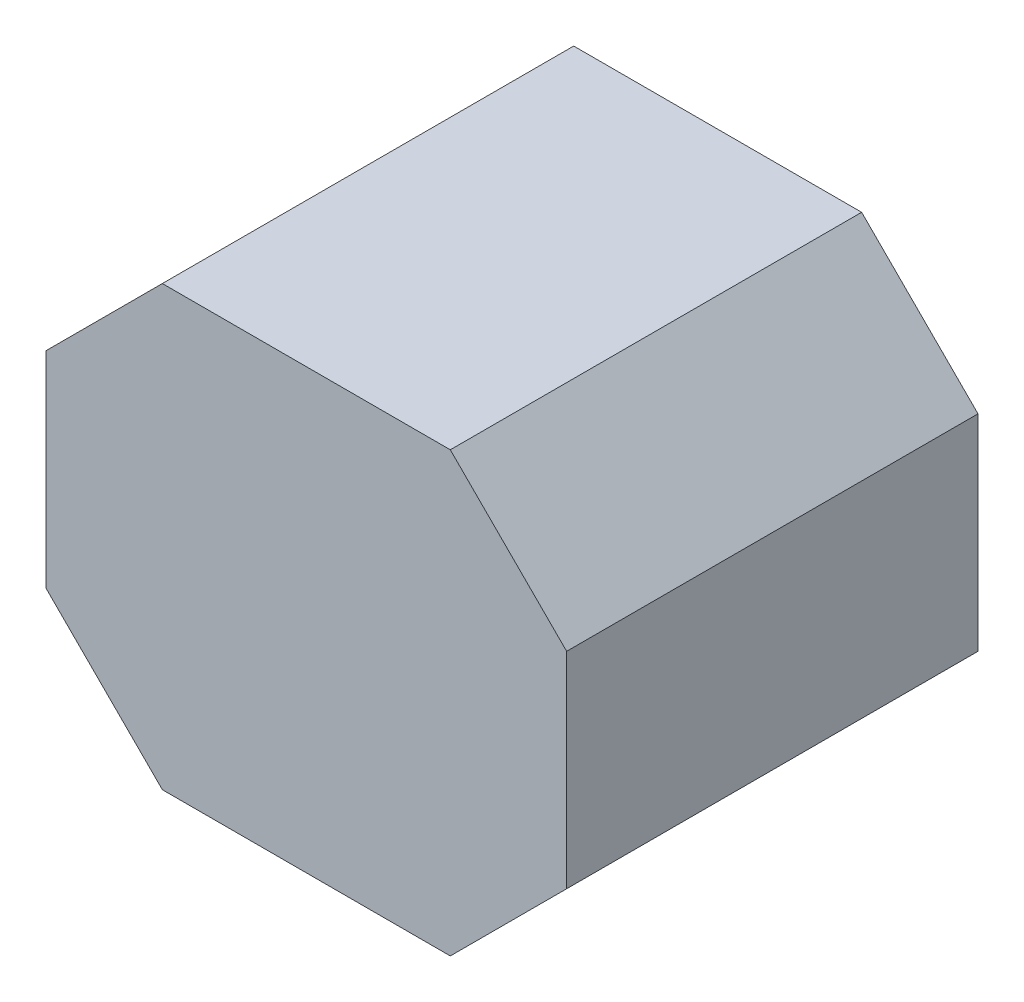
ISO-10303-21;
HEADER;
FILE_DESCRIPTION(('STEP AP214'),'2;1');
FILE_NAME('part.step','',(''),(''),'','','');
FILE_SCHEMA(('AUTOMOTIVE_DESIGN { 1 0 10303 214 1 1 1 1 }'));
ENDSEC;
DATA;
#1=APPLICATION_CONTEXT('core data for automotive mechanical design processes');
#2=APPLICATION_PROTOCOL_DEFINITION('international standard','automotive_design',2000,#1);
#3=PRODUCT_CONTEXT('',#1,'mechanical');
#4=PRODUCT('Part','Part','',(#3));
#5=PRODUCT_RELATED_PRODUCT_CATEGORY('part','',(#4));
#6=PRODUCT_DEFINITION_FORMATION('','',#4);
#7=PRODUCT_DEFINITION_CONTEXT('part definition',#1,'design');
#8=PRODUCT_DEFINITION('design','',#6,#7);
#9=PRODUCT_DEFINITION_SHAPE('','',#8);
#10=(LENGTH_UNIT() NAMED_UNIT(*) SI_UNIT(.MILLI.,.METRE.));
#11=(NAMED_UNIT(*) PLANE_ANGLE_UNIT() SI_UNIT($,.RADIAN.));
#12=(NAMED_UNIT(*) SI_UNIT($,.STERADIAN.) SOLID_ANGLE_UNIT());
#13=UNCERTAINTY_MEASURE_WITH_UNIT(LENGTH_MEASURE(1.E-05),#10,'distance_accuracy_value','');
#14=(GEOMETRIC_REPRESENTATION_CONTEXT(3) GLOBAL_UNCERTAINTY_ASSIGNED_CONTEXT((#13)) GLOBAL_UNIT_ASSIGNED_CONTEXT((#10,
#11,#12)) REPRESENTATION_CONTEXT('',''));
#15=CARTESIAN_POINT('',(0.,0.,0.));
#16=DIRECTION('',(0.,0.,1.));
#17=DIRECTION('',(1.,0.,0.));
#18=AXIS2_PLACEMENT_3D('',#15,#16,#17);
#19=CARTESIAN_POINT('',(-88.9,0.,127.));
#20=DIRECTION('',(0.707106781186546,0.707106781186549,0.));
#21=DIRECTION('',(-0.707106781186549,0.707106781186546,0.));
#22=AXIS2_PLACEMENT_3D('',#19,#20,#21);
#23=PLANE('',#22);
#24=DIRECTION('',(0.707106781186549,-0.707106781186546,0.));
#25=VECTOR('',#24,1.);
#26=CARTESIAN_POINT('',(-88.9,0.,-127.));
#27=LINE('',#26,#25);
#28=CARTESIAN_POINT('',(-160.742048968553,71.8420489685531,-127.));
#29=VERTEX_POINT('',#28);
#30=CARTESIAN_POINT('',(-88.9,0.,-127.));
#31=VERTEX_POINT('',#30);
#32=EDGE_CURVE('E144',#29,#31,#27,.T.);
#33=ORIENTED_EDGE('',*,*,#32,.T.);
#34=DIRECTION('',(0.,0.,-1.));
#35=VECTOR('',#34,1.);
#36=CARTESIAN_POINT('',(-88.9,0.,127.));
#37=LINE('',#36,#35);
#38=CARTESIAN_POINT('',(-88.9,0.,127.));
#39=VERTEX_POINT('',#38);
#40=EDGE_CURVE('E11',#39,#31,#37,.T.);
#41=ORIENTED_EDGE('',*,*,#40,.F.);
#42=DIRECTION('',(0.707106781186549,-0.707106781186546,0.));
#43=VECTOR('',#42,1.);
#44=CARTESIAN_POINT('',(-88.9,0.,127.));
#45=LINE('',#44,#43);
#46=CARTESIAN_POINT('',(-160.742048968553,71.8420489685531,127.));
#47=VERTEX_POINT('',#46);
#48=EDGE_CURVE('E166',#47,#39,#45,.T.);
#49=ORIENTED_EDGE('',*,*,#48,.F.);
#50=DIRECTION('',(0.,0.,-1.));
#51=VECTOR('',#50,1.);
#52=CARTESIAN_POINT('',(-160.742048968553,71.8420489685531,127.));
#53=LINE('',#52,#51);
#54=EDGE_CURVE('E140',#47,#29,#53,.T.);
#55=ORIENTED_EDGE('',*,*,#54,.T.);
#56=EDGE_LOOP('',(#33,#41,#49,#55));
#57=FACE_BOUND('',#56,.T.);
#58=ADVANCED_FACE('F43',(#57),#23,.F.);
#59=CARTESIAN_POINT('',(-88.9,0.,127.));
#60=DIRECTION('',(0.,1.,0.));
#61=DIRECTION('',(-1.,0.,0.));
#62=AXIS2_PLACEMENT_3D('',#59,#60,#61);
#63=PLANE('',#62);
#64=DIRECTION('',(1.,0.,0.));
#65=VECTOR('',#64,1.);
#66=CARTESIAN_POINT('',(-88.9,0.,-127.));
#67=LINE('',#66,#65);
#68=CARTESIAN_POINT('',(88.9,0.,-127.));
#69=VERTEX_POINT('',#68);
#70=EDGE_CURVE('E148',#31,#69,#67,.T.);
#71=ORIENTED_EDGE('',*,*,#70,.T.);
#72=DIRECTION('',(0.,0.,-1.));
#73=VECTOR('',#72,1.);
#74=CARTESIAN_POINT('',(88.9,0.,127.));
#75=LINE('',#74,#73);
#76=CARTESIAN_POINT('',(88.9,0.,127.));
#77=VERTEX_POINT('',#76);
#78=EDGE_CURVE('E52',#77,#69,#75,.T.);
#79=ORIENTED_EDGE('',*,*,#78,.F.);
#80=DIRECTION('',(1.,0.,0.));
#81=VECTOR('',#80,1.);
#82=CARTESIAN_POINT('',(-88.9,0.,127.));
#83=LINE('',#82,#81);
#84=EDGE_CURVE('E103',#39,#77,#83,.T.);
#85=ORIENTED_EDGE('',*,*,#84,.F.);
#86=ORIENTED_EDGE('',*,*,#40,.T.);
#87=EDGE_LOOP('',(#71,#79,#85,#86));
#88=FACE_BOUND('',#87,.T.);
#89=ADVANCED_FACE('F212',(#88),#63,.F.);
#90=CARTESIAN_POINT('',(88.9,0.,127.));
#91=DIRECTION('',(-0.707106781186546,0.707106781186549,0.));
#92=DIRECTION('',(-0.707106781186549,-0.707106781186546,0.));
#93=AXIS2_PLACEMENT_3D('',#90,#91,#92);
#94=PLANE('',#93);
#95=DIRECTION('',(0.707106781186549,0.707106781186546,0.));
#96=VECTOR('',#95,1.);
#97=CARTESIAN_POINT('',(88.9,0.,-127.));
#98=LINE('',#97,#96);
#99=CARTESIAN_POINT('',(160.742048968553,71.8420489685531,-127.));
#100=VERTEX_POINT('',#99);
#101=EDGE_CURVE('E151',#69,#100,#98,.T.);
#102=ORIENTED_EDGE('',*,*,#101,.T.);
#103=DIRECTION('',(0.,0.,-1.));
#104=VECTOR('',#103,1.);
#105=CARTESIAN_POINT('',(160.742048968553,71.8420489685531,127.));
#106=LINE('',#105,#104);
#107=CARTESIAN_POINT('',(160.742048968553,71.8420489685531,127.));
#108=VERTEX_POINT('',#107);
#109=EDGE_CURVE('E177',#108,#100,#106,.T.);
#110=ORIENTED_EDGE('',*,*,#109,.F.);
#111=DIRECTION('',(0.707106781186549,0.707106781186546,0.));
#112=VECTOR('',#111,1.);
#113=CARTESIAN_POINT('',(88.9,0.,127.));
#114=LINE('',#113,#112);
#115=EDGE_CURVE('E187',#77,#108,#114,.T.);
#116=ORIENTED_EDGE('',*,*,#115,.F.);
#117=ORIENTED_EDGE('',*,*,#78,.T.);
#118=EDGE_LOOP('',(#102,#110,#116,#117));
#119=FACE_BOUND('',#118,.T.);
#120=ADVANCED_FACE('F185',(#119),#94,.F.);
#121=CARTESIAN_POINT('',(160.742048968553,71.8420489685531,127.));
#122=DIRECTION('',(-1.,0.,0.));
#123=DIRECTION('',(0.,0.,1.));
#124=AXIS2_PLACEMENT_3D('',#121,#122,#123);
#125=PLANE('',#124);
#126=DIRECTION('',(0.,1.,0.));
#127=VECTOR('',#126,1.);
#128=CARTESIAN_POINT('',(160.742048968553,71.8420489685531,-127.));
#129=LINE('',#128,#127);
#130=CARTESIAN_POINT('',(160.742048968553,198.842048968553,-127.));
#131=VERTEX_POINT('',#130);
#132=EDGE_CURVE('E154',#100,#131,#129,.T.);
#133=ORIENTED_EDGE('',*,*,#132,.T.);
#134=DIRECTION('',(0.,0.,-1.));
#135=VECTOR('',#134,1.);
#136=CARTESIAN_POINT('',(160.742048968553,198.842048968553,127.));
#137=LINE('',#136,#135);
#138=CARTESIAN_POINT('',(160.742048968553,198.842048968553,127.));
#139=VERTEX_POINT('',#138);
#140=EDGE_CURVE('E173',#139,#131,#137,.T.);
#141=ORIENTED_EDGE('',*,*,#140,.F.);
#142=DIRECTION('',(0.,1.,0.));
#143=VECTOR('',#142,1.);
#144=CARTESIAN_POINT('',(160.742048968553,71.8420489685531,127.));
#145=LINE('',#144,#143);
#146=EDGE_CURVE('E200',#108,#139,#145,.T.);
#147=ORIENTED_EDGE('',*,*,#146,.F.);
#148=ORIENTED_EDGE('',*,*,#109,.T.);
#149=EDGE_LOOP('',(#133,#141,#147,#148));
#150=FACE_BOUND('',#149,.T.);
#151=ADVANCED_FACE('F195',(#150),#125,.F.);
#152=CARTESIAN_POINT('',(88.9,270.684097937106,127.));
#153=DIRECTION('',(-0.707106781186546,-0.707106781186549,0.));
#154=DIRECTION('',(0.707106781186549,-0.707106781186546,0.));
#155=AXIS2_PLACEMENT_3D('',#152,#153,#154);
#156=PLANE('',#155);
#157=DIRECTION('',(-0.707106781186549,0.707106781186546,0.));
#158=VECTOR('',#157,1.);
#159=CARTESIAN_POINT('',(88.9,270.684097937106,-127.));
#160=LINE('',#159,#158);
#161=CARTESIAN_POINT('',(88.9,270.684097937106,-127.));
#162=VERTEX_POINT('',#161);
#163=EDGE_CURVE('E157',#131,#162,#160,.T.);
#164=ORIENTED_EDGE('',*,*,#163,.T.);
#165=DIRECTION('',(0.,0.,-1.));
#166=VECTOR('',#165,1.);
#167=CARTESIAN_POINT('',(88.9,270.684097937106,127.));
#168=LINE('',#167,#166);
#169=CARTESIAN_POINT('',(88.9,270.684097937106,127.));
#170=VERTEX_POINT('',#169);
#171=EDGE_CURVE('E133',#170,#162,#168,.T.);
#172=ORIENTED_EDGE('',*,*,#171,.F.);
#173=DIRECTION('',(-0.707106781186549,0.707106781186546,0.));
#174=VECTOR('',#173,1.);
#175=CARTESIAN_POINT('',(88.9,270.684097937106,127.));
#176=LINE('',#175,#174);
#177=EDGE_CURVE('E122',#139,#170,#176,.T.);
#178=ORIENTED_EDGE('',*,*,#177,.F.);
#179=ORIENTED_EDGE('',*,*,#140,.T.);
#180=EDGE_LOOP('',(#164,#172,#178,#179));
#181=FACE_BOUND('',#180,.T.);
#182=ADVANCED_FACE('F198',(#181),#156,.F.);
#183=CARTESIAN_POINT('',(-88.9,270.684097937106,127.));
#184=DIRECTION('',(0.,-1.,0.));
#185=DIRECTION('',(0.,0.,-1.));
#186=AXIS2_PLACEMENT_3D('',#183,#184,#185);
#187=PLANE('',#186);
#188=DIRECTION('',(-1.,0.,0.));
#189=VECTOR('',#188,1.);
#190=CARTESIAN_POINT('',(-88.9,270.684097937106,-127.));
#191=LINE('',#190,#189);
#192=CARTESIAN_POINT('',(-88.9,270.684097937106,-127.));
#193=VERTEX_POINT('',#192);
#194=EDGE_CURVE('E131',#162,#193,#191,.T.);
#195=ORIENTED_EDGE('',*,*,#194,.T.);
#196=DIRECTION('',(0.,0.,-1.));
#197=VECTOR('',#196,1.);
#198=CARTESIAN_POINT('',(-88.9,270.684097937106,127.));
#199=LINE('',#198,#197);
#200=CARTESIAN_POINT('',(-88.9,270.684097937106,127.));
#201=VERTEX_POINT('',#200);
#202=EDGE_CURVE('E128',#201,#193,#199,.T.);
#203=ORIENTED_EDGE('',*,*,#202,.F.);
#204=DIRECTION('',(-1.,0.,0.));
#205=VECTOR('',#204,1.);
#206=CARTESIAN_POINT('',(-88.9,270.684097937106,127.));
#207=LINE('',#206,#205);
#208=EDGE_CURVE('E116',#170,#201,#207,.T.);
#209=ORIENTED_EDGE('',*,*,#208,.F.);
#210=ORIENTED_EDGE('',*,*,#171,.T.);
#211=EDGE_LOOP('',(#195,#203,#209,#210));
#212=FACE_BOUND('',#211,.T.);
#213=ADVANCED_FACE('F129',(#212),#187,.F.);
#214=CARTESIAN_POINT('',(-88.9,270.684097937106,127.));
#215=DIRECTION('',(0.707106781186546,-0.707106781186549,0.));
#216=DIRECTION('',(0.707106781186549,0.707106781186546,0.));
#217=AXIS2_PLACEMENT_3D('',#214,#215,#216);
#218=PLANE('',#217);
#219=DIRECTION('',(-0.707106781186549,-0.707106781186546,0.));
#220=VECTOR('',#219,1.);
#221=CARTESIAN_POINT('',(-88.9,270.684097937106,-127.));
#222=LINE('',#221,#220);
#223=CARTESIAN_POINT('',(-160.742048968553,198.842048968553,-127.));
#224=VERTEX_POINT('',#223);
#225=EDGE_CURVE('E89',#193,#224,#222,.T.);
#226=ORIENTED_EDGE('',*,*,#225,.T.);
#227=DIRECTION('',(0.,0.,-1.));
#228=VECTOR('',#227,1.);
#229=CARTESIAN_POINT('',(-160.742048968553,198.842048968553,127.));
#230=LINE('',#229,#228);
#231=CARTESIAN_POINT('',(-160.742048968553,198.842048968553,127.));
#232=VERTEX_POINT('',#231);
#233=EDGE_CURVE('E134',#232,#224,#230,.T.);
#234=ORIENTED_EDGE('',*,*,#233,.F.);
#235=DIRECTION('',(-0.707106781186549,-0.707106781186546,0.));
#236=VECTOR('',#235,1.);
#237=CARTESIAN_POINT('',(-88.9,270.684097937106,127.));
#238=LINE('',#237,#236);
#239=EDGE_CURVE('E120',#201,#232,#238,.T.);
#240=ORIENTED_EDGE('',*,*,#239,.F.);
#241=ORIENTED_EDGE('',*,*,#202,.T.);
#242=EDGE_LOOP('',(#226,#234,#240,#241));
#243=FACE_BOUND('',#242,.T.);
#244=ADVANCED_FACE('F136',(#243),#218,.F.);
#245=CARTESIAN_POINT('',(-160.742048968553,71.8420489685531,127.));
#246=DIRECTION('',(1.,0.,0.));
#247=DIRECTION('',(0.,0.,-1.));
#248=AXIS2_PLACEMENT_3D('',#245,#246,#247);
#249=PLANE('',#248);
#250=DIRECTION('',(0.,-1.,0.));
#251=VECTOR('',#250,1.);
#252=CARTESIAN_POINT('',(-160.742048968553,71.8420489685531,-127.));
#253=LINE('',#252,#251);
#254=EDGE_CURVE('E95',#224,#29,#253,.T.);
#255=ORIENTED_EDGE('',*,*,#254,.T.);
#256=ORIENTED_EDGE('',*,*,#54,.F.);
#257=DIRECTION('',(0.,-1.,0.));
#258=VECTOR('',#257,1.);
#259=CARTESIAN_POINT('',(-160.742048968553,71.8420489685531,127.));
#260=LINE('',#259,#258);
#261=EDGE_CURVE('E60',#232,#47,#260,.T.);
#262=ORIENTED_EDGE('',*,*,#261,.F.);
#263=ORIENTED_EDGE('',*,*,#233,.T.);
#264=EDGE_LOOP('',(#255,#256,#262,#263));
#265=FACE_BOUND('',#264,.T.);
#266=ADVANCED_FACE('F228',(#265),#249,.F.);
#267=CARTESIAN_POINT('',(0.,0.,127.));
#268=DIRECTION('',(0.,0.,1.));
#269=DIRECTION('',(1.,0.,0.));
#270=AXIS2_PLACEMENT_3D('',#267,#268,#269);
#271=PLANE('',#270);
#272=ORIENTED_EDGE('',*,*,#48,.T.);
#273=ORIENTED_EDGE('',*,*,#84,.T.);
#274=ORIENTED_EDGE('',*,*,#115,.T.);
#275=ORIENTED_EDGE('',*,*,#146,.T.);
#276=ORIENTED_EDGE('',*,*,#177,.T.);
#277=ORIENTED_EDGE('',*,*,#208,.T.);
#278=ORIENTED_EDGE('',*,*,#239,.T.);
#279=ORIENTED_EDGE('',*,*,#261,.T.);
#280=EDGE_LOOP('',(#272,#273,#274,#275,#276,#277,#278,#279));
#281=FACE_BOUND('',#280,.T.);
#282=ADVANCED_FACE('F118',(#281),#271,.T.);
#283=CARTESIAN_POINT('',(0.,0.,-127.));
#284=DIRECTION('',(0.,0.,1.));
#285=DIRECTION('',(1.,0.,0.));
#286=AXIS2_PLACEMENT_3D('',#283,#284,#285);
#287=PLANE('',#286);
#288=ORIENTED_EDGE('',*,*,#32,.F.);
#289=ORIENTED_EDGE('',*,*,#254,.F.);
#290=ORIENTED_EDGE('',*,*,#225,.F.);
#291=ORIENTED_EDGE('',*,*,#194,.F.);
#292=ORIENTED_EDGE('',*,*,#163,.F.);
#293=ORIENTED_EDGE('',*,*,#132,.F.);
#294=ORIENTED_EDGE('',*,*,#101,.F.);
#295=ORIENTED_EDGE('',*,*,#70,.F.);
#296=EDGE_LOOP('',(#288,#289,#290,#291,#292,#293,#294,#295));
#297=FACE_BOUND('',#296,.T.);
#298=ADVANCED_FACE('F191',(#297),#287,.F.);
#299=CLOSED_SHELL('',(#58,#89,#120,#151,#182,#213,#244,#266,#282,#298));
#300=MANIFOLD_SOLID_BREP('B2',#299);
#301=ADVANCED_BREP_SHAPE_REPRESENTATION('',(#18,#300),#14);
#302=SHAPE_DEFINITION_REPRESENTATION(#9,#301);
ENDSEC;
END-ISO-10303-21;
